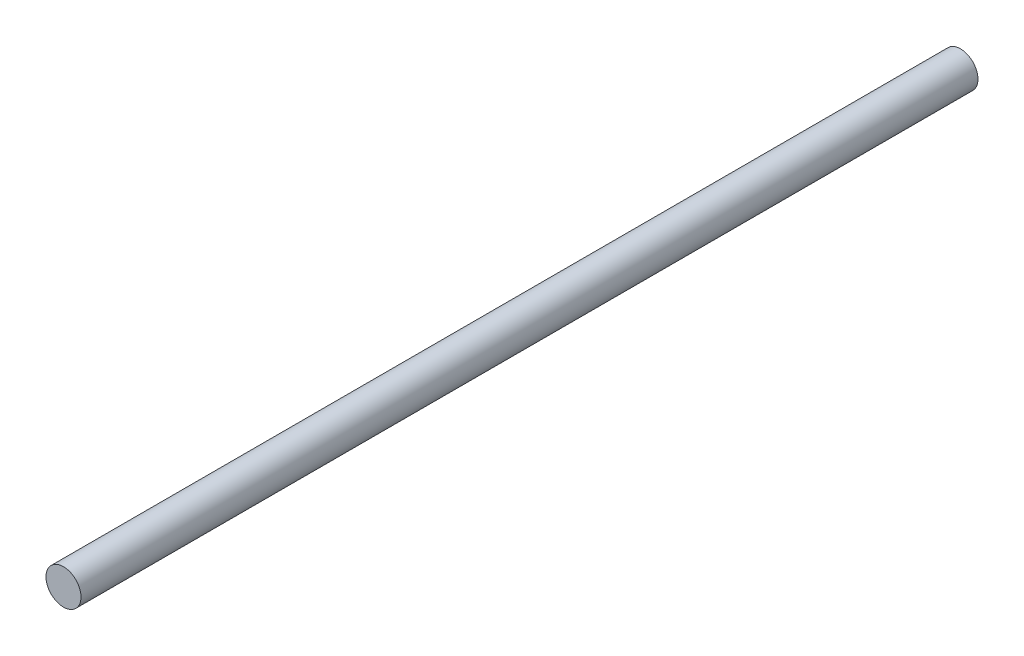
ISO-10303-21;
HEADER;
FILE_DESCRIPTION(('STEP AP214'),'2;1');
FILE_NAME('part.step','',(''),(''),'','','');
FILE_SCHEMA(('AUTOMOTIVE_DESIGN { 1 0 10303 214 1 1 1 1 }'));
ENDSEC;
DATA;
#1=APPLICATION_CONTEXT('core data for automotive mechanical design processes');
#2=APPLICATION_PROTOCOL_DEFINITION('international standard','automotive_design',2000,#1);
#3=PRODUCT_CONTEXT('',#1,'mechanical');
#4=PRODUCT('Part','Part','',(#3));
#5=PRODUCT_RELATED_PRODUCT_CATEGORY('part','',(#4));
#6=PRODUCT_DEFINITION_FORMATION('','',#4);
#7=PRODUCT_DEFINITION_CONTEXT('part definition',#1,'design');
#8=PRODUCT_DEFINITION('design','',#6,#7);
#9=PRODUCT_DEFINITION_SHAPE('','',#8);
#10=(LENGTH_UNIT() NAMED_UNIT(*) SI_UNIT(.MILLI.,.METRE.));
#11=(NAMED_UNIT(*) PLANE_ANGLE_UNIT() SI_UNIT($,.RADIAN.));
#12=(NAMED_UNIT(*) SI_UNIT($,.STERADIAN.) SOLID_ANGLE_UNIT());
#13=UNCERTAINTY_MEASURE_WITH_UNIT(LENGTH_MEASURE(1.E-05),#10,'distance_accuracy_value','');
#14=(GEOMETRIC_REPRESENTATION_CONTEXT(3) GLOBAL_UNCERTAINTY_ASSIGNED_CONTEXT((#13)) GLOBAL_UNIT_ASSIGNED_CONTEXT((#10,
#11,#12)) REPRESENTATION_CONTEXT('',''));
#15=CARTESIAN_POINT('',(0.,0.,0.));
#16=DIRECTION('',(0.,0.,1.));
#17=DIRECTION('',(1.,0.,0.));
#18=AXIS2_PLACEMENT_3D('',#15,#16,#17);
#19=CARTESIAN_POINT('',(0.,0.,203.2));
#20=DIRECTION('',(0.,0.,-1.));
#21=DIRECTION('',(-1.,0.,0.));
#22=AXIS2_PLACEMENT_3D('',#19,#20,#21);
#23=CYLINDRICAL_SURFACE('',#22,3.96875);
#24=CARTESIAN_POINT('',(0.,0.,203.2));
#25=DIRECTION('',(0.,0.,1.));
#26=DIRECTION('',(1.,0.,0.));
#27=AXIS2_PLACEMENT_3D('',#24,#25,#26);
#28=CIRCLE('',#27,3.96875);
#29=CARTESIAN_POINT('',(3.96875,0.,203.2));
#30=VERTEX_POINT('',#29);
#31=EDGE_CURVE('E10',#30,#30,#28,.T.);
#32=ORIENTED_EDGE('',*,*,#31,.F.);
#33=EDGE_LOOP('',(#32));
#34=FACE_BOUND('',#33,.T.);
#35=CARTESIAN_POINT('',(0.,0.,0.));
#36=DIRECTION('',(0.,0.,1.));
#37=DIRECTION('',(1.,0.,0.));
#38=AXIS2_PLACEMENT_3D('',#35,#36,#37);
#39=CIRCLE('',#38,3.96875);
#40=CARTESIAN_POINT('',(3.96875,0.,0.));
#41=VERTEX_POINT('',#40);
#42=EDGE_CURVE('E34',#41,#41,#39,.T.);
#43=ORIENTED_EDGE('',*,*,#42,.T.);
#44=EDGE_LOOP('',(#43));
#45=FACE_BOUND('',#44,.T.);
#46=ADVANCED_FACE('F31',(#34,#45),#23,.T.);
#47=CARTESIAN_POINT('',(0.,0.,203.2));
#48=DIRECTION('',(0.,0.,1.));
#49=DIRECTION('',(1.,0.,0.));
#50=AXIS2_PLACEMENT_3D('',#47,#48,#49);
#51=PLANE('',#50);
#52=ORIENTED_EDGE('',*,*,#31,.T.);
#53=EDGE_LOOP('',(#52));
#54=FACE_BOUND('',#53,.T.);
#55=ADVANCED_FACE('F46',(#54),#51,.T.);
#56=CARTESIAN_POINT('',(0.,0.,0.));
#57=DIRECTION('',(0.,0.,1.));
#58=DIRECTION('',(1.,0.,0.));
#59=AXIS2_PLACEMENT_3D('',#56,#57,#58);
#60=PLANE('',#59);
#61=ORIENTED_EDGE('',*,*,#42,.F.);
#62=EDGE_LOOP('',(#61));
#63=FACE_BOUND('',#62,.T.);
#64=ADVANCED_FACE('F44',(#63),#60,.F.);
#65=CLOSED_SHELL('',(#46,#55,#64));
#66=MANIFOLD_SOLID_BREP('B2',#65);
#67=ADVANCED_BREP_SHAPE_REPRESENTATION('',(#18,#66),#14);
#68=SHAPE_DEFINITION_REPRESENTATION(#9,#67);
ENDSEC;
END-ISO-10303-21;
